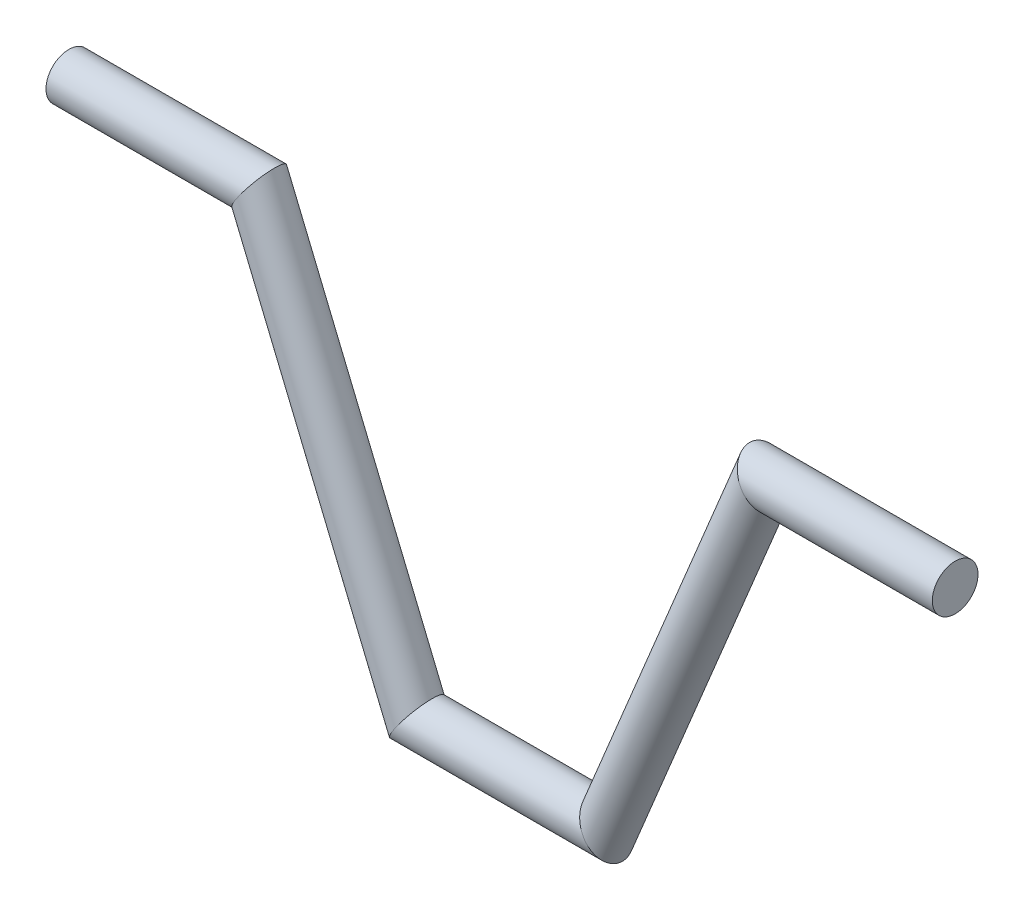
ISO-10303-21;
HEADER;
FILE_DESCRIPTION(('STEP AP214'),'2;1');
FILE_NAME('part.step','',(''),(''),'','','');
FILE_SCHEMA(('AUTOMOTIVE_DESIGN { 1 0 10303 214 1 1 1 1 }'));
ENDSEC;
DATA;
#1=APPLICATION_CONTEXT('core data for automotive mechanical design processes');
#2=APPLICATION_PROTOCOL_DEFINITION('international standard','automotive_design',2000,#1);
#3=PRODUCT_CONTEXT('',#1,'mechanical');
#4=PRODUCT('Part','Part','',(#3));
#5=PRODUCT_RELATED_PRODUCT_CATEGORY('part','',(#4));
#6=PRODUCT_DEFINITION_FORMATION('','',#4);
#7=PRODUCT_DEFINITION_CONTEXT('part definition',#1,'design');
#8=PRODUCT_DEFINITION('design','',#6,#7);
#9=PRODUCT_DEFINITION_SHAPE('','',#8);
#10=(LENGTH_UNIT() NAMED_UNIT(*) SI_UNIT(.MILLI.,.METRE.));
#11=(NAMED_UNIT(*) PLANE_ANGLE_UNIT() SI_UNIT($,.RADIAN.));
#12=(NAMED_UNIT(*) SI_UNIT($,.STERADIAN.) SOLID_ANGLE_UNIT());
#13=UNCERTAINTY_MEASURE_WITH_UNIT(LENGTH_MEASURE(1.E-05),#10,'distance_accuracy_value','');
#14=(GEOMETRIC_REPRESENTATION_CONTEXT(3) GLOBAL_UNCERTAINTY_ASSIGNED_CONTEXT((#13)) GLOBAL_UNIT_ASSIGNED_CONTEXT((#10,
#11,#12)) REPRESENTATION_CONTEXT('',''));
#15=CARTESIAN_POINT('',(0.,0.,0.));
#16=DIRECTION('',(0.,0.,1.));
#17=DIRECTION('',(1.,0.,0.));
#18=AXIS2_PLACEMENT_3D('',#15,#16,#17);
#19=CARTESIAN_POINT('',(-58.2106781186533,49.9999999999785,3.33066907387547E-13));
#20=DIRECTION('',(1.,0.,0.));
#21=DIRECTION('',(0.,0.,-0.999999999999975));
#22=AXIS2_PLACEMENT_3D('',#19,#20,#21);
#23=PLANE('',#22);
#24=CARTESIAN_POINT('',(-58.2106781186533,49.9999999999785,3.33066907387547E-13));
#25=DIRECTION('',(1.,0.,0.));
#26=DIRECTION('',(0.,0.,-0.999999999999975));
#27=AXIS2_PLACEMENT_3D('',#24,#25,#26);
#28=CIRCLE('',#27,3.);
#29=CARTESIAN_POINT('',(-58.2106781186541,50.0000000000012,-3.00000000000186));
#30=VERTEX_POINT('',#29);
#31=EDGE_CURVE('E33',#30,#30,#28,.T.);
#32=ORIENTED_EDGE('',*,*,#31,.F.);
#33=EDGE_LOOP('',(#32));
#34=FACE_BOUND('',#33,.T.);
#35=ADVANCED_FACE('F30',(#34),#23,.F.);
#36=CARTESIAN_POINT('',(58.2106781186549,49.9999999999807,-3.20576898360514E-12));
#37=DIRECTION('',(1.,0.,0.));
#38=DIRECTION('',(0.,0.,-0.999999999999975));
#39=AXIS2_PLACEMENT_3D('',#36,#37,#38);
#40=PLANE('',#39);
#41=CARTESIAN_POINT('',(58.2106781186549,49.9999999999807,-3.20576898360514E-12));
#42=DIRECTION('',(1.,0.,0.));
#43=DIRECTION('',(0.,0.,-0.999999999999975));
#44=AXIS2_PLACEMENT_3D('',#41,#42,#43);
#45=CIRCLE('',#44,3.);
#46=CARTESIAN_POINT('',(58.2106781186542,49.9999999999944,-3.00000000000525));
#47=VERTEX_POINT('',#46);
#48=EDGE_CURVE('E38',#47,#47,#45,.T.);
#49=ORIENTED_EDGE('',*,*,#48,.T.);
#50=EDGE_LOOP('',(#49));
#51=FACE_BOUND('',#50,.T.);
#52=ADVANCED_FACE('F81',(#51),#40,.T.);
#53=CARTESIAN_POINT('',(-28.7006991083865,49.9999999999799,-5.55111512312578E-13));
#54=DIRECTION('',(-1.,0.,0.));
#55=DIRECTION('',(0.,0.,0.999999999999975));
#56=AXIS2_PLACEMENT_3D('',#53,#54,#55);
#57=CYLINDRICAL_SURFACE('',#56,3.);
#58=CARTESIAN_POINT('',(-33.2106781186539,50.0000000000007,-2.35922392732846E-12));
#59=DIRECTION('',(-0.831469612302546,0.555570233019667,0.));
#60=DIRECTION('',(0.555570233019602,0.831469612302621,0.));
#61=AXIS2_PLACEMENT_3D('',#58,#59,#60);
#62=ELLIPSE('',#61,3.60806932161028,3.);
#63=CARTESIAN_POINT('',(-31.2061422048959,52.999999999974,-1.16573417585641E-12));
#64=VERTEX_POINT('',#63);
#65=EDGE_CURVE('E48',#64,#64,#62,.T.);
#66=ORIENTED_EDGE('',*,*,#65,.T.);
#67=EDGE_LOOP('',(#66));
#68=FACE_BOUND('',#67,.T.);
#69=ORIENTED_EDGE('',*,*,#31,.T.);
#70=EDGE_LOOP('',(#69));
#71=FACE_BOUND('',#70,.T.);
#72=ADVANCED_FACE('F78',(#68,#71),#57,.T.);
#73=CARTESIAN_POINT('',(-10.7741057524566,-4.16667729968234,-1.72084568816899E-12));
#74=DIRECTION('',(-0.382683432365085,0.923879532511403,0.));
#75=DIRECTION('',(-0.923879532511293,-0.382683432365129,0.));
#76=AXIS2_PLACEMENT_3D('',#73,#74,#75);
#77=CYLINDRICAL_SURFACE('',#76,3.);
#78=CARTESIAN_POINT('',(-12.4999999999994,-3.65263375101677E-11,-3.94129173741931E-12));
#79=DIRECTION('',(-0.831469612302549,0.555570233019653,0.));
#80=DIRECTION('',(-0.555570233019601,-0.831469612302618,0.));
#81=AXIS2_PLACEMENT_3D('',#78,#79,#80);
#82=ELLIPSE('',#81,3.60806932161028,3.);
#83=CARTESIAN_POINT('',(-14.5045359137568,-3.00000000000256,-5.55111512312578E-13));
#84=VERTEX_POINT('',#83);
#85=EDGE_CURVE('E71',#84,#84,#82,.T.);
#86=ORIENTED_EDGE('',*,*,#85,.T.);
#87=EDGE_LOOP('',(#86));
#88=FACE_BOUND('',#87,.T.);
#89=ORIENTED_EDGE('',*,*,#65,.F.);
#90=EDGE_LOOP('',(#89));
#91=FACE_BOUND('',#90,.T.);
#92=ADVANCED_FACE('F80',(#88,#91),#77,.T.);
#93=CARTESIAN_POINT('',(17.0099790102677,-3.27515792264421E-11,-4.94049245958195E-12));
#94=DIRECTION('',(-1.,0.,0.));
#95=DIRECTION('',(0.,0.,0.999999999999975));
#96=AXIS2_PLACEMENT_3D('',#93,#94,#95);
#97=CYLINDRICAL_SURFACE('',#96,3.);
#98=CARTESIAN_POINT('',(12.5000000000006,-2.66453525910038E-11,-3.30291349825984E-12));
#99=DIRECTION('',(-0.831469612302538,-0.555570233019666,0.));
#100=DIRECTION('',(0.555570233019602,-0.831469612302658,0.));
#101=AXIS2_PLACEMENT_3D('',#98,#99,#100);
#102=ELLIPSE('',#101,3.60806932161027,3.);
#103=CARTESIAN_POINT('',(14.504535913758,-3.00000000000988,-4.35762537165374E-12));
#104=VERTEX_POINT('',#103);
#105=EDGE_CURVE('E69',#104,#104,#102,.T.);
#106=ORIENTED_EDGE('',*,*,#105,.T.);
#107=EDGE_LOOP('',(#106));
#108=FACE_BOUND('',#107,.T.);
#109=ORIENTED_EDGE('',*,*,#85,.F.);
#110=EDGE_LOOP('',(#109));
#111=FACE_BOUND('',#110,.T.);
#112=ADVANCED_FACE('F66',(#108,#111),#97,.T.);
#113=CARTESIAN_POINT('',(34.9365723661983,54.166677299614,-3.51108031537706E-12));
#114=DIRECTION('',(-0.382683432365091,-0.923879532511387,0.));
#115=DIRECTION('',(0.923879532511287,-0.382683432365133,0.));
#116=AXIS2_PLACEMENT_3D('',#113,#114,#115);
#117=CYLINDRICAL_SURFACE('',#116,3.);
#118=CARTESIAN_POINT('',(33.2106781186555,49.9999999999761,-3.76088049591772E-12));
#119=DIRECTION('',(-0.831469612302536,-0.555570233019673,0.));
#120=DIRECTION('',(-0.555570233019603,0.831469612302641,0.));
#121=AXIS2_PLACEMENT_3D('',#118,#119,#120);
#122=ELLIPSE('',#121,3.60806932161027,3.);
#123=CARTESIAN_POINT('',(31.2061422048975,53.0000000000003,-4.24660306919122E-12));
#124=VERTEX_POINT('',#123);
#125=EDGE_CURVE('E11',#124,#124,#122,.T.);
#126=ORIENTED_EDGE('',*,*,#125,.T.);
#127=EDGE_LOOP('',(#126));
#128=FACE_BOUND('',#127,.T.);
#129=ORIENTED_EDGE('',*,*,#105,.F.);
#130=EDGE_LOOP('',(#129));
#131=FACE_BOUND('',#130,.T.);
#132=ADVANCED_FACE('F63',(#128,#131),#117,.T.);
#133=CARTESIAN_POINT('',(58.2106781186549,49.9999999999807,-3.20576898360514E-12));
#134=DIRECTION('',(-1.,0.,0.));
#135=DIRECTION('',(0.,-1.00000000000009,0.));
#136=AXIS2_PLACEMENT_3D('',#133,#134,#135);
#137=CYLINDRICAL_SURFACE('',#136,3.);
#138=ORIENTED_EDGE('',*,*,#48,.F.);
#139=EDGE_LOOP('',(#138));
#140=FACE_BOUND('',#139,.T.);
#141=ORIENTED_EDGE('',*,*,#125,.F.);
#142=EDGE_LOOP('',(#141));
#143=FACE_BOUND('',#142,.T.);
#144=ADVANCED_FACE('F61',(#140,#143),#137,.T.);
#145=CLOSED_SHELL('',(#35,#52,#72,#92,#112,#132,#144));
#146=MANIFOLD_SOLID_BREP('B2',#145);
#147=ADVANCED_BREP_SHAPE_REPRESENTATION('',(#18,#146),#14);
#148=SHAPE_DEFINITION_REPRESENTATION(#9,#147);
ENDSEC;
END-ISO-10303-21;
